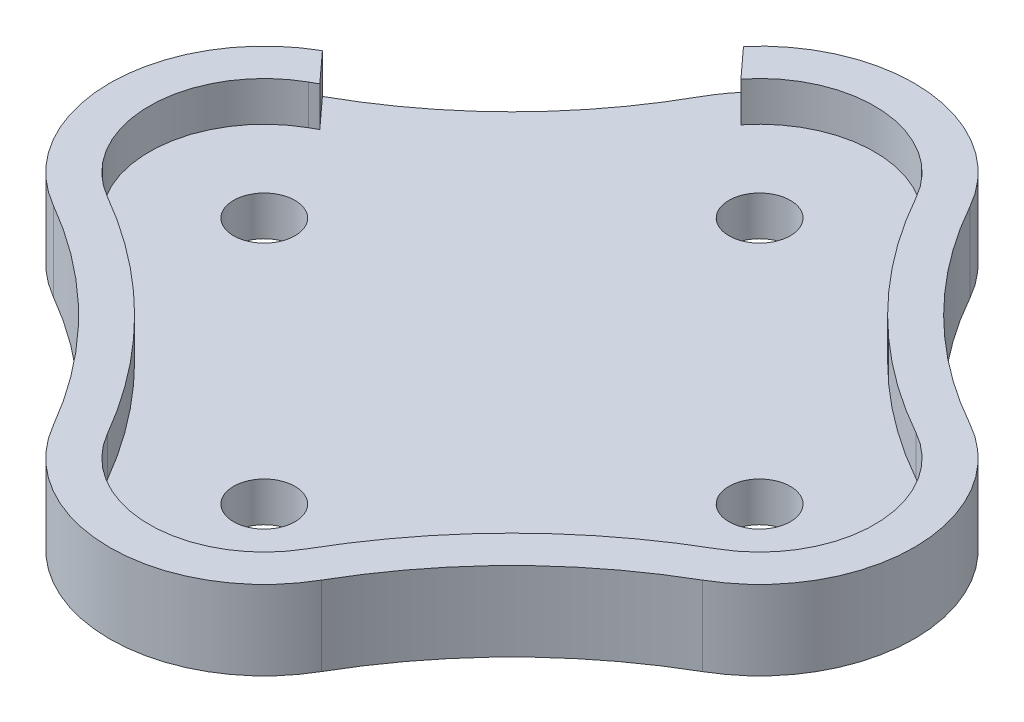
ISO-10303-21;
HEADER;
FILE_DESCRIPTION(('STEP AP214'),'2;1');
FILE_NAME('part.step','',(''),(''),'','','');
FILE_SCHEMA(('AUTOMOTIVE_DESIGN { 1 0 10303 214 1 1 1 1 }'));
ENDSEC;
DATA;
#1=APPLICATION_CONTEXT('core data for automotive mechanical design processes');
#2=APPLICATION_PROTOCOL_DEFINITION('international standard','automotive_design',2000,#1);
#3=PRODUCT_CONTEXT('',#1,'mechanical');
#4=PRODUCT('Part','Part','',(#3));
#5=PRODUCT_RELATED_PRODUCT_CATEGORY('part','',(#4));
#6=PRODUCT_DEFINITION_FORMATION('','',#4);
#7=PRODUCT_DEFINITION_CONTEXT('part definition',#1,'design');
#8=PRODUCT_DEFINITION('design','',#6,#7);
#9=PRODUCT_DEFINITION_SHAPE('','',#8);
#10=(LENGTH_UNIT() NAMED_UNIT(*) SI_UNIT(.MILLI.,.METRE.));
#11=(NAMED_UNIT(*) PLANE_ANGLE_UNIT() SI_UNIT($,.RADIAN.));
#12=(NAMED_UNIT(*) SI_UNIT($,.STERADIAN.) SOLID_ANGLE_UNIT());
#13=UNCERTAINTY_MEASURE_WITH_UNIT(LENGTH_MEASURE(1.E-05),#10,'distance_accuracy_value','');
#14=(GEOMETRIC_REPRESENTATION_CONTEXT(3) GLOBAL_UNCERTAINTY_ASSIGNED_CONTEXT((#13)) GLOBAL_UNIT_ASSIGNED_CONTEXT((#10,
#11,#12)) REPRESENTATION_CONTEXT('',''));
#15=CARTESIAN_POINT('',(0.,0.,0.));
#16=DIRECTION('',(0.,0.,1.));
#17=DIRECTION('',(1.,0.,0.));
#18=AXIS2_PLACEMENT_3D('',#15,#16,#17);
#19=CARTESIAN_POINT('',(-28.2177604684682,4.,-28.2177604684683));
#20=DIRECTION('',(0.,-1.,0.));
#21=DIRECTION('',(0.,0.,-1.));
#22=AXIS2_PLACEMENT_3D('',#19,#20,#21);
#23=CYLINDRICAL_SURFACE('',#22,24.5);
#24=CARTESIAN_POINT('',(-28.2177604684682,2.,-28.2177604684683));
#25=DIRECTION('',(0.,1.,0.));
#26=DIRECTION('',(0.,0.,1.));
#27=AXIS2_PLACEMENT_3D('',#24,#25,#26);
#28=CIRCLE('',#27,24.5);
#29=CARTESIAN_POINT('',(-6.81419602644114,2.,-16.2956201750481));
#30=VERTEX_POINT('',#29);
#31=CARTESIAN_POINT('',(-16.295620175048,2.,-6.81419602644126));
#32=VERTEX_POINT('',#31);
#33=EDGE_CURVE('E396',#30,#32,#28,.F.);
#34=ORIENTED_EDGE('',*,*,#33,.F.);
#35=DIRECTION('',(0.,-1.,0.));
#36=VECTOR('',#35,1.);
#37=CARTESIAN_POINT('',(-6.81419602644114,4.,-16.2956201750481));
#38=LINE('',#37,#36);
#39=CARTESIAN_POINT('',(-6.81419602644114,0.,-16.2956201750481));
#40=VERTEX_POINT('',#39);
#41=EDGE_CURVE('E51',#30,#40,#38,.T.);
#42=ORIENTED_EDGE('',*,*,#41,.T.);
#43=CARTESIAN_POINT('',(-28.2177604684682,0.,-28.2177604684683));
#44=DIRECTION('',(0.,1.,0.));
#45=DIRECTION('',(0.,0.,1.));
#46=AXIS2_PLACEMENT_3D('',#43,#44,#45);
#47=CIRCLE('',#46,24.5);
#48=CARTESIAN_POINT('',(-16.295620175048,0.,-6.81419602644126));
#49=VERTEX_POINT('',#48);
#50=EDGE_CURVE('E313',#40,#49,#47,.F.);
#51=ORIENTED_EDGE('',*,*,#50,.T.);
#52=DIRECTION('',(0.,-1.,0.));
#53=VECTOR('',#52,1.);
#54=CARTESIAN_POINT('',(-16.295620175048,4.,-6.81419602644126));
#55=LINE('',#54,#53);
#56=EDGE_CURVE('E352',#32,#49,#55,.T.);
#57=ORIENTED_EDGE('',*,*,#56,.F.);
#58=EDGE_LOOP('',(#34,#42,#51,#57));
#59=FACE_BOUND('',#58,.T.);
#60=ADVANCED_FACE('F41',(#59),#23,.F.);
#61=CARTESIAN_POINT('',(28.2177604684684,4.,-28.2177604684683));
#62=DIRECTION('',(0.,-1.,0.));
#63=DIRECTION('',(0.,0.,-1.));
#64=AXIS2_PLACEMENT_3D('',#61,#62,#63);
#65=CYLINDRICAL_SURFACE('',#64,24.5);
#66=CARTESIAN_POINT('',(28.2177604684684,0.,-28.2177604684683));
#67=DIRECTION('',(0.,1.,0.));
#68=DIRECTION('',(0.,0.,1.));
#69=AXIS2_PLACEMENT_3D('',#66,#67,#68);
#70=CIRCLE('',#69,24.5);
#71=CARTESIAN_POINT('',(6.81419602644138,0.,-16.2956201750481));
#72=VERTEX_POINT('',#71);
#73=CARTESIAN_POINT('',(16.2956201750482,0.,-6.81419602644127));
#74=VERTEX_POINT('',#73);
#75=EDGE_CURVE('E231',#72,#74,#70,.T.);
#76=ORIENTED_EDGE('',*,*,#75,.F.);
#77=DIRECTION('',(0.,-1.,0.));
#78=VECTOR('',#77,1.);
#79=CARTESIAN_POINT('',(6.81419602644138,4.,-16.2956201750481));
#80=LINE('',#79,#78);
#81=CARTESIAN_POINT('',(6.81419602644138,4.,-16.2956201750481));
#82=VERTEX_POINT('',#81);
#83=EDGE_CURVE('E11',#82,#72,#80,.T.);
#84=ORIENTED_EDGE('',*,*,#83,.F.);
#85=CARTESIAN_POINT('',(28.2177604684684,4.,-28.2177604684683));
#86=DIRECTION('',(0.,1.,0.));
#87=DIRECTION('',(0.,0.,1.));
#88=AXIS2_PLACEMENT_3D('',#85,#86,#87);
#89=CIRCLE('',#88,24.5);
#90=CARTESIAN_POINT('',(16.2956201750482,4.,-6.81419602644127));
#91=VERTEX_POINT('',#90);
#92=EDGE_CURVE('E279',#82,#91,#89,.T.);
#93=ORIENTED_EDGE('',*,*,#92,.T.);
#94=DIRECTION('',(0.,-1.,0.));
#95=VECTOR('',#94,1.);
#96=CARTESIAN_POINT('',(16.2956201750482,4.,-6.81419602644127));
#97=LINE('',#96,#95);
#98=EDGE_CURVE('E336',#91,#74,#97,.T.);
#99=ORIENTED_EDGE('',*,*,#98,.T.);
#100=EDGE_LOOP('',(#76,#84,#93,#99));
#101=FACE_BOUND('',#100,.T.);
#102=ADVANCED_FACE('F472',(#101),#65,.F.);
#103=CARTESIAN_POINT('',(1.2270583501045E-13,4.,-12.5));
#104=DIRECTION('',(0.,-1.,0.));
#105=DIRECTION('',(0.,0.,-1.));
#106=AXIS2_PLACEMENT_3D('',#103,#104,#105);
#107=CYLINDRICAL_SURFACE('',#106,7.79999999999999);
#108=CARTESIAN_POINT('',(1.2270583501045E-13,2.,-12.5));
#109=DIRECTION('',(0.,1.,0.));
#110=DIRECTION('',(0.,0.,1.));
#111=AXIS2_PLACEMENT_3D('',#108,#109,#110);
#112=CIRCLE('',#111,7.79999999999999);
#113=CARTESIAN_POINT('',(-5.90750188174963,2.,-17.5932721817239));
#114=VERTEX_POINT('',#113);
#115=EDGE_CURVE('E237',#114,#30,#112,.T.);
#116=ORIENTED_EDGE('',*,*,#115,.F.);
#117=DIRECTION('',(0.,-1.,0.));
#118=VECTOR('',#117,1.);
#119=CARTESIAN_POINT('',(-5.90750188174963,4.,-17.5932721817239));
#120=LINE('',#119,#118);
#121=CARTESIAN_POINT('',(-5.90750188174963,4.,-17.5932721817239));
#122=VERTEX_POINT('',#121);
#123=EDGE_CURVE('E401',#114,#122,#120,.F.);
#124=ORIENTED_EDGE('',*,*,#123,.T.);
#125=CARTESIAN_POINT('',(1.2270583501045E-13,4.,-12.5));
#126=DIRECTION('',(0.,1.,0.));
#127=DIRECTION('',(0.,0.,1.));
#128=AXIS2_PLACEMENT_3D('',#125,#126,#127);
#129=CIRCLE('',#128,7.79999999999999);
#130=EDGE_CURVE('E283',#82,#122,#129,.T.);
#131=ORIENTED_EDGE('',*,*,#130,.F.);
#132=ORIENTED_EDGE('',*,*,#83,.T.);
#133=CARTESIAN_POINT('',(1.2270583501045E-13,0.,-12.5));
#134=DIRECTION('',(0.,1.,0.));
#135=DIRECTION('',(0.,0.,1.));
#136=AXIS2_PLACEMENT_3D('',#133,#134,#135);
#137=CIRCLE('',#136,7.79999999999999);
#138=EDGE_CURVE('E309',#72,#40,#137,.T.);
#139=ORIENTED_EDGE('',*,*,#138,.T.);
#140=ORIENTED_EDGE('',*,*,#41,.F.);
#141=EDGE_LOOP('',(#116,#124,#131,#132,#139,#140));
#142=FACE_BOUND('',#141,.T.);
#143=ADVANCED_FACE('F434',(#142),#107,.T.);
#144=CARTESIAN_POINT('',(-12.4999999999999,4.,0.));
#145=DIRECTION('',(0.,-1.,0.));
#146=DIRECTION('',(0.,0.,-1.));
#147=AXIS2_PLACEMENT_3D('',#144,#145,#146);
#148=CYLINDRICAL_SURFACE('',#147,7.79999999999999);
#149=CARTESIAN_POINT('',(-12.4999999999999,4.,0.));
#150=DIRECTION('',(0.,1.,0.));
#151=DIRECTION('',(0.,0.,1.));
#152=AXIS2_PLACEMENT_3D('',#149,#150,#151);
#153=CIRCLE('',#152,7.79999999999999);
#154=CARTESIAN_POINT('',(-16.3497763919851,4.,-6.7837468799855));
#155=VERTEX_POINT('',#154);
#156=CARTESIAN_POINT('',(-16.3866068250551,4.,6.76271301974543));
#157=VERTEX_POINT('',#156);
#158=EDGE_CURVE('E287',#155,#157,#153,.T.);
#159=ORIENTED_EDGE('',*,*,#158,.F.);
#160=DIRECTION('',(0.,-1.,0.));
#161=VECTOR('',#160,1.);
#162=CARTESIAN_POINT('',(-16.3497763919851,4.,-6.7837468799855));
#163=LINE('',#162,#161);
#164=CARTESIAN_POINT('',(-16.3497763919851,2.,-6.7837468799855));
#165=VERTEX_POINT('',#164);
#166=EDGE_CURVE('E59',#155,#165,#163,.T.);
#167=ORIENTED_EDGE('',*,*,#166,.T.);
#168=CARTESIAN_POINT('',(-12.4999999999999,2.,0.));
#169=DIRECTION('',(0.,1.,0.));
#170=DIRECTION('',(0.,0.,1.));
#171=AXIS2_PLACEMENT_3D('',#168,#169,#170);
#172=CIRCLE('',#171,7.79999999999999);
#173=EDGE_CURVE('E188',#32,#165,#172,.T.);
#174=ORIENTED_EDGE('',*,*,#173,.F.);
#175=ORIENTED_EDGE('',*,*,#56,.T.);
#176=CARTESIAN_POINT('',(-12.4999999999999,0.,0.));
#177=DIRECTION('',(0.,1.,0.));
#178=DIRECTION('',(0.,0.,1.));
#179=AXIS2_PLACEMENT_3D('',#176,#177,#178);
#180=CIRCLE('',#179,7.79999999999999);
#181=CARTESIAN_POINT('',(-16.3866068250551,0.,6.76271301974543));
#182=VERTEX_POINT('',#181);
#183=EDGE_CURVE('E317',#49,#182,#180,.T.);
#184=ORIENTED_EDGE('',*,*,#183,.T.);
#185=DIRECTION('',(0.,-1.,0.));
#186=VECTOR('',#185,1.);
#187=CARTESIAN_POINT('',(-16.3866068250551,4.,6.76271301974543));
#188=LINE('',#187,#186);
#189=EDGE_CURVE('E348',#157,#182,#188,.T.);
#190=ORIENTED_EDGE('',*,*,#189,.F.);
#191=EDGE_LOOP('',(#159,#167,#174,#175,#184,#190));
#192=FACE_BOUND('',#191,.T.);
#193=ADVANCED_FACE('F443',(#192),#148,.T.);
#194=CARTESIAN_POINT('',(-29.3917912012012,4.,29.3917912012013));
#195=DIRECTION('',(0.,-1.,0.));
#196=DIRECTION('',(0.,0.,-1.));
#197=AXIS2_PLACEMENT_3D('',#194,#195,#196);
#198=CYLINDRICAL_SURFACE('',#197,26.1);
#199=CARTESIAN_POINT('',(-29.3917912012012,0.,29.3917912012013));
#200=DIRECTION('',(0.,1.,0.));
#201=DIRECTION('',(0.,0.,1.));
#202=AXIS2_PLACEMENT_3D('',#199,#200,#201);
#203=CIRCLE('',#202,26.1);
#204=CARTESIAN_POINT('',(-6.76271301974532,0.,16.3866068250552));
#205=VERTEX_POINT('',#204);
#206=EDGE_CURVE('E321',#182,#205,#203,.F.);
#207=ORIENTED_EDGE('',*,*,#206,.T.);
#208=DIRECTION('',(0.,-1.,0.));
#209=VECTOR('',#208,1.);
#210=CARTESIAN_POINT('',(-6.76271301974532,4.,16.3866068250552));
#211=LINE('',#210,#209);
#212=CARTESIAN_POINT('',(-6.76271301974532,4.,16.3866068250552));
#213=VERTEX_POINT('',#212);
#214=EDGE_CURVE('E345',#213,#205,#211,.T.);
#215=ORIENTED_EDGE('',*,*,#214,.F.);
#216=CARTESIAN_POINT('',(-29.3917912012012,4.,29.3917912012013));
#217=DIRECTION('',(0.,1.,0.));
#218=DIRECTION('',(0.,0.,1.));
#219=AXIS2_PLACEMENT_3D('',#216,#217,#218);
#220=CIRCLE('',#219,26.1);
#221=EDGE_CURVE('E290',#157,#213,#220,.F.);
#222=ORIENTED_EDGE('',*,*,#221,.F.);
#223=ORIENTED_EDGE('',*,*,#189,.T.);
#224=EDGE_LOOP('',(#207,#215,#222,#223));
#225=FACE_BOUND('',#224,.T.);
#226=ADVANCED_FACE('F453',(#225),#198,.F.);
#227=CARTESIAN_POINT('',(1.25767452008319E-13,4.,12.5));
#228=DIRECTION('',(0.,-1.,0.));
#229=DIRECTION('',(0.,0.,-1.));
#230=AXIS2_PLACEMENT_3D('',#227,#228,#229);
#231=CYLINDRICAL_SURFACE('',#230,7.8);
#232=CARTESIAN_POINT('',(1.25767452008319E-13,0.,12.5));
#233=DIRECTION('',(0.,1.,0.));
#234=DIRECTION('',(0.,0.,1.));
#235=AXIS2_PLACEMENT_3D('',#232,#233,#234);
#236=CIRCLE('',#235,7.8);
#237=CARTESIAN_POINT('',(6.76271301974557,0.,16.3866068250552));
#238=VERTEX_POINT('',#237);
#239=EDGE_CURVE('E325',#238,#205,#236,.F.);
#240=ORIENTED_EDGE('',*,*,#239,.F.);
#241=DIRECTION('',(0.,-1.,0.));
#242=VECTOR('',#241,1.);
#243=CARTESIAN_POINT('',(6.76271301974557,4.,16.3866068250552));
#244=LINE('',#243,#242);
#245=CARTESIAN_POINT('',(6.76271301974557,4.,16.3866068250552));
#246=VERTEX_POINT('',#245);
#247=EDGE_CURVE('E342',#246,#238,#244,.T.);
#248=ORIENTED_EDGE('',*,*,#247,.F.);
#249=CARTESIAN_POINT('',(1.25767452008319E-13,4.,12.5));
#250=DIRECTION('',(0.,1.,0.));
#251=DIRECTION('',(0.,0.,1.));
#252=AXIS2_PLACEMENT_3D('',#249,#250,#251);
#253=CIRCLE('',#252,7.8);
#254=EDGE_CURVE('E293',#246,#213,#253,.F.);
#255=ORIENTED_EDGE('',*,*,#254,.T.);
#256=ORIENTED_EDGE('',*,*,#214,.T.);
#257=EDGE_LOOP('',(#240,#248,#255,#256));
#258=FACE_BOUND('',#257,.T.);
#259=ADVANCED_FACE('F613',(#258),#231,.T.);
#260=CARTESIAN_POINT('',(29.3917912012015,4.,29.3917912012013));
#261=DIRECTION('',(0.,-1.,0.));
#262=DIRECTION('',(0.,0.,-1.));
#263=AXIS2_PLACEMENT_3D('',#260,#261,#262);
#264=CYLINDRICAL_SURFACE('',#263,26.1);
#265=CARTESIAN_POINT('',(29.3917912012015,0.,29.3917912012013));
#266=DIRECTION('',(0.,1.,0.));
#267=DIRECTION('',(0.,0.,1.));
#268=AXIS2_PLACEMENT_3D('',#265,#266,#267);
#269=CIRCLE('',#268,26.1);
#270=CARTESIAN_POINT('',(16.3866068250553,0.,6.76271301974544));
#271=VERTEX_POINT('',#270);
#272=EDGE_CURVE('E329',#271,#238,#269,.T.);
#273=ORIENTED_EDGE('',*,*,#272,.F.);
#274=DIRECTION('',(0.,-1.,0.));
#275=VECTOR('',#274,1.);
#276=CARTESIAN_POINT('',(16.3866068250553,4.,6.76271301974544));
#277=LINE('',#276,#275);
#278=CARTESIAN_POINT('',(16.3866068250553,4.,6.76271301974544));
#279=VERTEX_POINT('',#278);
#280=EDGE_CURVE('E339',#279,#271,#277,.T.);
#281=ORIENTED_EDGE('',*,*,#280,.F.);
#282=CARTESIAN_POINT('',(29.3917912012015,4.,29.3917912012013));
#283=DIRECTION('',(0.,1.,0.));
#284=DIRECTION('',(0.,0.,1.));
#285=AXIS2_PLACEMENT_3D('',#282,#283,#284);
#286=CIRCLE('',#285,26.1);
#287=EDGE_CURVE('E297',#279,#246,#286,.T.);
#288=ORIENTED_EDGE('',*,*,#287,.T.);
#289=ORIENTED_EDGE('',*,*,#247,.T.);
#290=EDGE_LOOP('',(#273,#281,#288,#289));
#291=FACE_BOUND('',#290,.T.);
#292=ADVANCED_FACE('F619',(#291),#264,.F.);
#293=CARTESIAN_POINT('',(12.5000000000001,4.,0.));
#294=DIRECTION('',(0.,-1.,0.));
#295=DIRECTION('',(0.,0.,-1.));
#296=AXIS2_PLACEMENT_3D('',#293,#294,#295);
#297=CYLINDRICAL_SURFACE('',#296,5.79999999999999);
#298=DIRECTION('',(0.,-1.,0.));
#299=VECTOR('',#298,1.);
#300=CARTESIAN_POINT('',(15.3223842327282,4.,-5.06696627607171));
#301=LINE('',#300,#299);
#302=CARTESIAN_POINT('',(15.3223842327282,4.,-5.06696627607171));
#303=VERTEX_POINT('',#302);
#304=CARTESIAN_POINT('',(15.3223842327282,2.,-5.06696627607171));
#305=VERTEX_POINT('',#304);
#306=EDGE_CURVE('E305',#303,#305,#301,.T.);
#307=ORIENTED_EDGE('',*,*,#306,.T.);
#308=CARTESIAN_POINT('',(12.5000000000001,2.,0.));
#309=DIRECTION('',(0.,1.,0.));
#310=DIRECTION('',(0.,0.,1.));
#311=AXIS2_PLACEMENT_3D('',#308,#309,#310);
#312=CIRCLE('',#311,5.79999999999999);
#313=CARTESIAN_POINT('',(15.3900409724771,2.,5.02868404032352));
#314=VERTEX_POINT('',#313);
#315=EDGE_CURVE('E67',#305,#314,#312,.F.);
#316=ORIENTED_EDGE('',*,*,#315,.T.);
#317=DIRECTION('',(0.,-1.,0.));
#318=VECTOR('',#317,1.);
#319=CARTESIAN_POINT('',(15.3900409724771,4.,5.02868404032352));
#320=LINE('',#319,#318);
#321=CARTESIAN_POINT('',(15.3900409724771,4.,5.02868404032352));
#322=VERTEX_POINT('',#321);
#323=EDGE_CURVE('E45',#322,#314,#320,.T.);
#324=ORIENTED_EDGE('',*,*,#323,.F.);
#325=CARTESIAN_POINT('',(12.5000000000001,4.,0.));
#326=DIRECTION('',(0.,1.,0.));
#327=DIRECTION('',(0.,0.,1.));
#328=AXIS2_PLACEMENT_3D('',#325,#326,#327);
#329=CIRCLE('',#328,5.79999999999999);
#330=EDGE_CURVE('E250',#303,#322,#329,.F.);
#331=ORIENTED_EDGE('',*,*,#330,.F.);
#332=EDGE_LOOP('',(#307,#316,#324,#331));
#333=FACE_BOUND('',#332,.T.);
#334=ADVANCED_FACE('F43',(#333),#297,.F.);
#335=CARTESIAN_POINT('',(29.3917912012015,4.,29.3917912012013));
#336=DIRECTION('',(0.,-1.,0.));
#337=DIRECTION('',(0.,0.,-1.));
#338=AXIS2_PLACEMENT_3D('',#335,#336,#337);
#339=CYLINDRICAL_SURFACE('',#338,28.1);
#340=ORIENTED_EDGE('',*,*,#323,.T.);
#341=CARTESIAN_POINT('',(29.3917912012015,2.,29.3917912012013));
#342=DIRECTION('',(0.,1.,0.));
#343=DIRECTION('',(0.,0.,1.));
#344=AXIS2_PLACEMENT_3D('',#341,#342,#343);
#345=CIRCLE('',#344,28.1);
#346=CARTESIAN_POINT('',(5.02868404032366,2.,15.3900409724769));
#347=VERTEX_POINT('',#346);
#348=EDGE_CURVE('E249',#314,#347,#345,.T.);
#349=ORIENTED_EDGE('',*,*,#348,.T.);
#350=DIRECTION('',(0.,-1.,0.));
#351=VECTOR('',#350,1.);
#352=CARTESIAN_POINT('',(5.02868404032366,4.,15.3900409724769));
#353=LINE('',#352,#351);
#354=CARTESIAN_POINT('',(5.02868404032366,4.,15.3900409724769));
#355=VERTEX_POINT('',#354);
#356=EDGE_CURVE('E373',#355,#347,#353,.T.);
#357=ORIENTED_EDGE('',*,*,#356,.F.);
#358=CARTESIAN_POINT('',(29.3917912012015,4.,29.3917912012013));
#359=DIRECTION('',(0.,1.,0.));
#360=DIRECTION('',(0.,0.,1.));
#361=AXIS2_PLACEMENT_3D('',#358,#359,#360);
#362=CIRCLE('',#361,28.1);
#363=EDGE_CURVE('E254',#322,#355,#362,.T.);
#364=ORIENTED_EDGE('',*,*,#363,.F.);
#365=EDGE_LOOP('',(#340,#349,#357,#364));
#366=FACE_BOUND('',#365,.T.);
#367=ADVANCED_FACE('F384',(#366),#339,.T.);
#368=CARTESIAN_POINT('',(1.25767452008319E-13,4.,12.5));
#369=DIRECTION('',(0.,-1.,0.));
#370=DIRECTION('',(0.,0.,-1.));
#371=AXIS2_PLACEMENT_3D('',#368,#369,#370);
#372=CYLINDRICAL_SURFACE('',#371,5.79999999999999);
#373=ORIENTED_EDGE('',*,*,#356,.T.);
#374=CARTESIAN_POINT('',(1.25767452008319E-13,2.,12.5));
#375=DIRECTION('',(0.,1.,0.));
#376=DIRECTION('',(0.,0.,1.));
#377=AXIS2_PLACEMENT_3D('',#374,#375,#376);
#378=CIRCLE('',#377,5.79999999999999);
#379=CARTESIAN_POINT('',(-5.0286840403234,2.,15.3900409724769));
#380=VERTEX_POINT('',#379);
#381=EDGE_CURVE('E211',#347,#380,#378,.F.);
#382=ORIENTED_EDGE('',*,*,#381,.T.);
#383=DIRECTION('',(0.,-1.,0.));
#384=VECTOR('',#383,1.);
#385=CARTESIAN_POINT('',(-5.0286840403234,4.,15.3900409724769));
#386=LINE('',#385,#384);
#387=CARTESIAN_POINT('',(-5.0286840403234,4.,15.3900409724769));
#388=VERTEX_POINT('',#387);
#389=EDGE_CURVE('E370',#388,#380,#386,.T.);
#390=ORIENTED_EDGE('',*,*,#389,.F.);
#391=CARTESIAN_POINT('',(1.25767452008319E-13,4.,12.5));
#392=DIRECTION('',(0.,1.,0.));
#393=DIRECTION('',(0.,0.,1.));
#394=AXIS2_PLACEMENT_3D('',#391,#392,#393);
#395=CIRCLE('',#394,5.79999999999999);
#396=EDGE_CURVE('E258',#355,#388,#395,.F.);
#397=ORIENTED_EDGE('',*,*,#396,.F.);
#398=EDGE_LOOP('',(#373,#382,#390,#397));
#399=FACE_BOUND('',#398,.T.);
#400=ADVANCED_FACE('F463',(#399),#372,.F.);
#401=CARTESIAN_POINT('',(-29.3917912012012,4.,29.3917912012013));
#402=DIRECTION('',(0.,-1.,0.));
#403=DIRECTION('',(0.,0.,-1.));
#404=AXIS2_PLACEMENT_3D('',#401,#402,#403);
#405=CYLINDRICAL_SURFACE('',#404,28.1);
#406=CARTESIAN_POINT('',(-29.3917912012012,2.,29.3917912012013));
#407=DIRECTION('',(0.,1.,0.));
#408=DIRECTION('',(0.,0.,1.));
#409=AXIS2_PLACEMENT_3D('',#406,#407,#408);
#410=CIRCLE('',#409,28.1);
#411=CARTESIAN_POINT('',(-15.3900409724768,2.,5.02868404032353));
#412=VERTEX_POINT('',#411);
#413=EDGE_CURVE('E202',#412,#380,#410,.F.);
#414=ORIENTED_EDGE('',*,*,#413,.F.);
#415=DIRECTION('',(0.,-1.,0.));
#416=VECTOR('',#415,1.);
#417=CARTESIAN_POINT('',(-15.3900409724768,4.,5.02868404032353));
#418=LINE('',#417,#416);
#419=CARTESIAN_POINT('',(-15.3900409724768,4.,5.02868404032353));
#420=VERTEX_POINT('',#419);
#421=EDGE_CURVE('E366',#420,#412,#418,.T.);
#422=ORIENTED_EDGE('',*,*,#421,.F.);
#423=CARTESIAN_POINT('',(-29.3917912012012,4.,29.3917912012013));
#424=DIRECTION('',(0.,1.,0.));
#425=DIRECTION('',(0.,0.,1.));
#426=AXIS2_PLACEMENT_3D('',#423,#424,#425);
#427=CIRCLE('',#426,28.1);
#428=EDGE_CURVE('E261',#420,#388,#427,.F.);
#429=ORIENTED_EDGE('',*,*,#428,.T.);
#430=ORIENTED_EDGE('',*,*,#389,.T.);
#431=EDGE_LOOP('',(#414,#422,#429,#430));
#432=FACE_BOUND('',#431,.T.);
#433=ADVANCED_FACE('F461',(#432),#405,.T.);
#434=CARTESIAN_POINT('',(-12.4999999999999,4.,0.));
#435=DIRECTION('',(0.,-1.,0.));
#436=DIRECTION('',(0.,0.,-1.));
#437=AXIS2_PLACEMENT_3D('',#434,#435,#436);
#438=CYLINDRICAL_SURFACE('',#437,5.79999999999999);
#439=CARTESIAN_POINT('',(-12.4999999999999,2.,0.));
#440=DIRECTION('',(0.,1.,0.));
#441=DIRECTION('',(0.,0.,1.));
#442=AXIS2_PLACEMENT_3D('',#439,#440,#441);
#443=CIRCLE('',#442,5.79999999999999);
#444=CARTESIAN_POINT('',(-15.3223842327279,2.,-5.06696627607171));
#445=VERTEX_POINT('',#444);
#446=EDGE_CURVE('E197',#445,#412,#443,.T.);
#447=ORIENTED_EDGE('',*,*,#446,.F.);
#448=DIRECTION('',(0.,-1.,0.));
#449=VECTOR('',#448,1.);
#450=CARTESIAN_POINT('',(-15.3223842327279,4.,-5.06696627607171));
#451=LINE('',#450,#449);
#452=CARTESIAN_POINT('',(-15.3223842327279,4.,-5.06696627607171));
#453=VERTEX_POINT('',#452);
#454=EDGE_CURVE('E195',#453,#445,#451,.T.);
#455=ORIENTED_EDGE('',*,*,#454,.F.);
#456=CARTESIAN_POINT('',(-12.4999999999999,4.,0.));
#457=DIRECTION('',(0.,1.,0.));
#458=DIRECTION('',(0.,0.,1.));
#459=AXIS2_PLACEMENT_3D('',#456,#457,#458);
#460=CIRCLE('',#459,5.79999999999999);
#461=EDGE_CURVE('E265',#453,#420,#460,.T.);
#462=ORIENTED_EDGE('',*,*,#461,.T.);
#463=ORIENTED_EDGE('',*,*,#421,.T.);
#464=EDGE_LOOP('',(#447,#455,#462,#463));
#465=FACE_BOUND('',#464,.T.);
#466=ADVANCED_FACE('F458',(#465),#438,.F.);
#467=CARTESIAN_POINT('',(-28.2177604684682,4.,-28.2177604684683));
#468=DIRECTION('',(0.,-1.,0.));
#469=DIRECTION('',(0.,0.,-1.));
#470=AXIS2_PLACEMENT_3D('',#467,#468,#469);
#471=CYLINDRICAL_SURFACE('',#470,26.5);
#472=DIRECTION('',(0.,-1.,0.));
#473=VECTOR('',#472,1.);
#474=CARTESIAN_POINT('',(-14.9665509170412,4.,-5.26878564552317));
#475=LINE('',#474,#473);
#476=CARTESIAN_POINT('',(-14.9665509170412,4.,-5.26878564552317));
#477=VERTEX_POINT('',#476);
#478=CARTESIAN_POINT('',(-14.9665509170412,2.,-5.26878564552317));
#479=VERTEX_POINT('',#478);
#480=EDGE_CURVE('E173',#477,#479,#475,.T.);
#481=ORIENTED_EDGE('',*,*,#480,.F.);
#482=CARTESIAN_POINT('',(-28.2177604684682,4.,-28.2177604684683));
#483=DIRECTION('',(0.,1.,0.));
#484=DIRECTION('',(0.,0.,1.));
#485=AXIS2_PLACEMENT_3D('',#482,#483,#484);
#486=CIRCLE('',#485,26.5);
#487=EDGE_CURVE('E269',#477,#453,#486,.F.);
#488=ORIENTED_EDGE('',*,*,#487,.T.);
#489=ORIENTED_EDGE('',*,*,#454,.T.);
#490=CARTESIAN_POINT('',(-28.2177604684682,2.,-28.2177604684683));
#491=DIRECTION('',(0.,1.,0.));
#492=DIRECTION('',(0.,0.,1.));
#493=AXIS2_PLACEMENT_3D('',#490,#491,#492);
#494=CIRCLE('',#493,26.5);
#495=EDGE_CURVE('E185',#479,#445,#494,.F.);
#496=ORIENTED_EDGE('',*,*,#495,.F.);
#497=EDGE_LOOP('',(#481,#488,#489,#496));
#498=FACE_BOUND('',#497,.T.);
#499=ADVANCED_FACE('F193',(#498),#471,.T.);
#500=CARTESIAN_POINT('',(1.2270583501045E-13,4.,-12.5));
#501=DIRECTION('',(0.,-1.,0.));
#502=DIRECTION('',(0.,0.,-1.));
#503=AXIS2_PLACEMENT_3D('',#500,#501,#502);
#504=CYLINDRICAL_SURFACE('',#503,5.79999999999999);
#505=DIRECTION('',(0.,-1.,0.));
#506=VECTOR('',#505,1.);
#507=CARTESIAN_POINT('',(-4.54592549274391,4.,-16.1020218509082));
#508=LINE('',#507,#506);
#509=CARTESIAN_POINT('',(-4.54592549274391,2.,-16.1020218509082));
#510=VERTEX_POINT('',#509);
#511=CARTESIAN_POINT('',(-4.54592549274391,4.,-16.1020218509082));
#512=VERTEX_POINT('',#511);
#513=EDGE_CURVE('E405',#510,#512,#508,.F.);
#514=ORIENTED_EDGE('',*,*,#513,.F.);
#515=CARTESIAN_POINT('',(1.2270583501045E-13,2.,-12.5));
#516=DIRECTION('',(0.,1.,0.));
#517=DIRECTION('',(0.,0.,1.));
#518=AXIS2_PLACEMENT_3D('',#515,#516,#517);
#519=CIRCLE('',#518,5.79999999999999);
#520=CARTESIAN_POINT('',(5.06696627607183,2.,-15.3223842327281));
#521=VERTEX_POINT('',#520);
#522=EDGE_CURVE('E198',#521,#510,#519,.T.);
#523=ORIENTED_EDGE('',*,*,#522,.F.);
#524=DIRECTION('',(0.,-1.,0.));
#525=VECTOR('',#524,1.);
#526=CARTESIAN_POINT('',(5.06696627607183,4.,-15.3223842327281));
#527=LINE('',#526,#525);
#528=CARTESIAN_POINT('',(5.06696627607183,4.,-15.3223842327281));
#529=VERTEX_POINT('',#528);
#530=EDGE_CURVE('E360',#529,#521,#527,.T.);
#531=ORIENTED_EDGE('',*,*,#530,.F.);
#532=CARTESIAN_POINT('',(1.2270583501045E-13,4.,-12.5));
#533=DIRECTION('',(0.,1.,0.));
#534=DIRECTION('',(0.,0.,1.));
#535=AXIS2_PLACEMENT_3D('',#532,#533,#534);
#536=CIRCLE('',#535,5.79999999999999);
#537=EDGE_CURVE('E272',#529,#512,#536,.T.);
#538=ORIENTED_EDGE('',*,*,#537,.T.);
#539=EDGE_LOOP('',(#514,#523,#531,#538));
#540=FACE_BOUND('',#539,.T.);
#541=ADVANCED_FACE('F424',(#540),#504,.F.);
#542=CARTESIAN_POINT('',(28.2177604684684,4.,-28.2177604684683));
#543=DIRECTION('',(0.,-1.,0.));
#544=DIRECTION('',(0.,0.,-1.));
#545=AXIS2_PLACEMENT_3D('',#542,#543,#544);
#546=CYLINDRICAL_SURFACE('',#545,26.5);
#547=ORIENTED_EDGE('',*,*,#530,.T.);
#548=CARTESIAN_POINT('',(28.2177604684684,2.,-28.2177604684683));
#549=DIRECTION('',(0.,1.,0.));
#550=DIRECTION('',(0.,0.,1.));
#551=AXIS2_PLACEMENT_3D('',#548,#549,#550);
#552=CIRCLE('',#551,26.5);
#553=EDGE_CURVE('E205',#521,#305,#552,.T.);
#554=ORIENTED_EDGE('',*,*,#553,.T.);
#555=ORIENTED_EDGE('',*,*,#306,.F.);
#556=CARTESIAN_POINT('',(28.2177604684684,4.,-28.2177604684683));
#557=DIRECTION('',(0.,1.,0.));
#558=DIRECTION('',(0.,0.,1.));
#559=AXIS2_PLACEMENT_3D('',#556,#557,#558);
#560=CIRCLE('',#559,26.5);
#561=EDGE_CURVE('E276',#529,#303,#560,.T.);
#562=ORIENTED_EDGE('',*,*,#561,.F.);
#563=EDGE_LOOP('',(#547,#554,#555,#562));
#564=FACE_BOUND('',#563,.T.);
#565=ADVANCED_FACE('F427',(#564),#546,.T.);
#566=CARTESIAN_POINT('',(12.5000000000001,4.,0.));
#567=DIRECTION('',(0.,-1.,0.));
#568=DIRECTION('',(0.,0.,-1.));
#569=AXIS2_PLACEMENT_3D('',#566,#567,#568);
#570=CYLINDRICAL_SURFACE('',#569,7.8);
#571=CARTESIAN_POINT('',(12.5000000000001,0.,0.));
#572=DIRECTION('',(0.,1.,0.));
#573=DIRECTION('',(0.,0.,1.));
#574=AXIS2_PLACEMENT_3D('',#571,#572,#573);
#575=CIRCLE('',#574,7.8);
#576=EDGE_CURVE('E255',#74,#271,#575,.F.);
#577=ORIENTED_EDGE('',*,*,#576,.F.);
#578=ORIENTED_EDGE('',*,*,#98,.F.);
#579=CARTESIAN_POINT('',(12.5000000000001,4.,0.));
#580=DIRECTION('',(0.,1.,0.));
#581=DIRECTION('',(0.,0.,1.));
#582=AXIS2_PLACEMENT_3D('',#579,#580,#581);
#583=CIRCLE('',#582,7.8);
#584=EDGE_CURVE('E301',#91,#279,#583,.F.);
#585=ORIENTED_EDGE('',*,*,#584,.T.);
#586=ORIENTED_EDGE('',*,*,#280,.T.);
#587=EDGE_LOOP('',(#577,#578,#585,#586));
#588=FACE_BOUND('',#587,.T.);
#589=ADVANCED_FACE('F486',(#588),#570,.T.);
#590=CARTESIAN_POINT('',(0.,4.,0.));
#591=DIRECTION('',(0.,1.,0.));
#592=DIRECTION('',(0.,0.,1.));
#593=AXIS2_PLACEMENT_3D('',#590,#591,#592);
#594=PLANE('',#593);
#595=DIRECTION('',(-0.674269364021333,0.,-0.738485493928125));
#596=VECTOR('',#595,1.);
#597=CARTESIAN_POINT('',(-2.55259116379505,4.,-13.9188461572975));
#598=LINE('',#597,#596);
#599=EDGE_CURVE('E410',#512,#122,#598,.T.);
#600=ORIENTED_EDGE('',*,*,#599,.F.);
#601=ORIENTED_EDGE('',*,*,#537,.F.);
#602=ORIENTED_EDGE('',*,*,#561,.T.);
#603=ORIENTED_EDGE('',*,*,#330,.T.);
#604=ORIENTED_EDGE('',*,*,#363,.T.);
#605=ORIENTED_EDGE('',*,*,#396,.T.);
#606=ORIENTED_EDGE('',*,*,#428,.F.);
#607=ORIENTED_EDGE('',*,*,#461,.F.);
#608=ORIENTED_EDGE('',*,*,#487,.F.);
#609=DIRECTION('',(0.674269364021332,0.,0.738485493928126));
#610=VECTOR('',#609,1.);
#611=CARTESIAN_POINT('',(-17.6754897568449,4.,-8.23571866054626));
#612=LINE('',#611,#610);
#613=EDGE_CURVE('E177',#155,#477,#612,.T.);
#614=ORIENTED_EDGE('',*,*,#613,.F.);
#615=ORIENTED_EDGE('',*,*,#158,.T.);
#616=ORIENTED_EDGE('',*,*,#221,.T.);
#617=ORIENTED_EDGE('',*,*,#254,.F.);
#618=ORIENTED_EDGE('',*,*,#287,.F.);
#619=ORIENTED_EDGE('',*,*,#584,.F.);
#620=ORIENTED_EDGE('',*,*,#92,.F.);
#621=ORIENTED_EDGE('',*,*,#130,.T.);
#622=EDGE_LOOP('',(#600,#601,#602,#603,#604,#605,#606,#607,#608,#614,#615,#616,#617,#618,#619,
#620,#621));
#623=FACE_BOUND('',#622,.T.);
#624=ADVANCED_FACE('F430',(#623),#594,.T.);
#625=CARTESIAN_POINT('',(0.,0.,0.));
#626=DIRECTION('',(0.,1.,0.));
#627=DIRECTION('',(0.,0.,1.));
#628=AXIS2_PLACEMENT_3D('',#625,#626,#627);
#629=PLANE('',#628);
#630=ORIENTED_EDGE('',*,*,#75,.T.);
#631=ORIENTED_EDGE('',*,*,#576,.T.);
#632=ORIENTED_EDGE('',*,*,#272,.T.);
#633=ORIENTED_EDGE('',*,*,#239,.T.);
#634=ORIENTED_EDGE('',*,*,#206,.F.);
#635=ORIENTED_EDGE('',*,*,#183,.F.);
#636=ORIENTED_EDGE('',*,*,#50,.F.);
#637=ORIENTED_EDGE('',*,*,#138,.F.);
#638=EDGE_LOOP('',(#630,#631,#632,#633,#634,#635,#636,#637));
#639=FACE_BOUND('',#638,.T.);
#640=CARTESIAN_POINT('',(1.25767452008319E-13,0.,12.5));
#641=DIRECTION('',(0.,1.,0.));
#642=DIRECTION('',(0.,0.,1.));
#643=AXIS2_PLACEMENT_3D('',#640,#641,#642);
#644=CIRCLE('',#643,1.55);
#645=CARTESIAN_POINT('',(1.25767452008319E-13,0.,14.05));
#646=VERTEX_POINT('',#645);
#647=EDGE_CURVE('E232',#646,#646,#644,.T.);
#648=ORIENTED_EDGE('',*,*,#647,.T.);
#649=EDGE_LOOP('',(#648));
#650=FACE_BOUND('',#649,.T.);
#651=CARTESIAN_POINT('',(12.5000000000001,0.,0.));
#652=DIRECTION('',(0.,1.,0.));
#653=DIRECTION('',(0.,0.,1.));
#654=AXIS2_PLACEMENT_3D('',#651,#652,#653);
#655=CIRCLE('',#654,1.55);
#656=CARTESIAN_POINT('',(12.5000000000001,0.,1.55));
#657=VERTEX_POINT('',#656);
#658=EDGE_CURVE('E236',#657,#657,#655,.T.);
#659=ORIENTED_EDGE('',*,*,#658,.T.);
#660=EDGE_LOOP('',(#659));
#661=FACE_BOUND('',#660,.T.);
#662=CARTESIAN_POINT('',(1.2270583501045E-13,0.,-12.5));
#663=DIRECTION('',(0.,1.,0.));
#664=DIRECTION('',(0.,0.,1.));
#665=AXIS2_PLACEMENT_3D('',#662,#663,#664);
#666=CIRCLE('',#665,1.55);
#667=CARTESIAN_POINT('',(1.2270583501045E-13,0.,-10.95));
#668=VERTEX_POINT('',#667);
#669=EDGE_CURVE('E241',#668,#668,#666,.T.);
#670=ORIENTED_EDGE('',*,*,#669,.T.);
#671=EDGE_LOOP('',(#670));
#672=FACE_BOUND('',#671,.T.);
#673=CARTESIAN_POINT('',(-12.4999999999999,0.,0.));
#674=DIRECTION('',(0.,1.,0.));
#675=DIRECTION('',(0.,0.,1.));
#676=AXIS2_PLACEMENT_3D('',#673,#674,#675);
#677=CIRCLE('',#676,1.55);
#678=CARTESIAN_POINT('',(-12.4999999999999,0.,1.55));
#679=VERTEX_POINT('',#678);
#680=EDGE_CURVE('E245',#679,#679,#677,.T.);
#681=ORIENTED_EDGE('',*,*,#680,.T.);
#682=EDGE_LOOP('',(#681));
#683=FACE_BOUND('',#682,.T.);
#684=ADVANCED_FACE('F446',(#639,#650,#661,#672,#683),#629,.F.);
#685=CARTESIAN_POINT('',(1.2270583501045E-13,2.,-12.5));
#686=DIRECTION('',(0.,-1.,0.));
#687=DIRECTION('',(0.,0.,-1.));
#688=AXIS2_PLACEMENT_3D('',#685,#686,#687);
#689=CYLINDRICAL_SURFACE('',#688,1.55);
#690=CARTESIAN_POINT('',(1.2270583501045E-13,2.,-12.5));
#691=DIRECTION('',(0.,1.,0.));
#692=DIRECTION('',(0.,0.,1.));
#693=AXIS2_PLACEMENT_3D('',#690,#691,#692);
#694=CIRCLE('',#693,1.55);
#695=CARTESIAN_POINT('',(1.2270583501045E-13,2.,-10.95));
#696=VERTEX_POINT('',#695);
#697=EDGE_CURVE('E223',#696,#696,#694,.T.);
#698=ORIENTED_EDGE('',*,*,#697,.T.);
#699=EDGE_LOOP('',(#698));
#700=FACE_BOUND('',#699,.T.);
#701=ORIENTED_EDGE('',*,*,#669,.F.);
#702=EDGE_LOOP('',(#701));
#703=FACE_BOUND('',#702,.T.);
#704=ADVANCED_FACE('F531',(#700,#703),#689,.F.);
#705=CARTESIAN_POINT('',(12.5000000000001,2.,0.));
#706=DIRECTION('',(0.,-1.,0.));
#707=DIRECTION('',(0.,0.,-1.));
#708=AXIS2_PLACEMENT_3D('',#705,#706,#707);
#709=CYLINDRICAL_SURFACE('',#708,1.55);
#710=CARTESIAN_POINT('',(12.5000000000001,2.,0.));
#711=DIRECTION('',(0.,1.,0.));
#712=DIRECTION('',(0.,0.,1.));
#713=AXIS2_PLACEMENT_3D('',#710,#711,#712);
#714=CIRCLE('',#713,1.55);
#715=CARTESIAN_POINT('',(12.5000000000001,2.,1.55));
#716=VERTEX_POINT('',#715);
#717=EDGE_CURVE('E219',#716,#716,#714,.T.);
#718=ORIENTED_EDGE('',*,*,#717,.T.);
#719=EDGE_LOOP('',(#718));
#720=FACE_BOUND('',#719,.T.);
#721=ORIENTED_EDGE('',*,*,#658,.F.);
#722=EDGE_LOOP('',(#721));
#723=FACE_BOUND('',#722,.T.);
#724=ADVANCED_FACE('F538',(#720,#723),#709,.F.);
#725=CARTESIAN_POINT('',(1.25767452008319E-13,2.,12.5));
#726=DIRECTION('',(0.,-1.,0.));
#727=DIRECTION('',(0.,0.,-1.));
#728=AXIS2_PLACEMENT_3D('',#725,#726,#727);
#729=CYLINDRICAL_SURFACE('',#728,1.55);
#730=CARTESIAN_POINT('',(1.25767452008319E-13,2.,12.5));
#731=DIRECTION('',(0.,1.,0.));
#732=DIRECTION('',(0.,0.,1.));
#733=AXIS2_PLACEMENT_3D('',#730,#731,#732);
#734=CIRCLE('',#733,1.55);
#735=CARTESIAN_POINT('',(1.25767452008319E-13,2.,14.05));
#736=VERTEX_POINT('',#735);
#737=EDGE_CURVE('E215',#736,#736,#734,.T.);
#738=ORIENTED_EDGE('',*,*,#737,.T.);
#739=EDGE_LOOP('',(#738));
#740=FACE_BOUND('',#739,.T.);
#741=ORIENTED_EDGE('',*,*,#647,.F.);
#742=EDGE_LOOP('',(#741));
#743=FACE_BOUND('',#742,.T.);
#744=ADVANCED_FACE('F546',(#740,#743),#729,.F.);
#745=CARTESIAN_POINT('',(-12.4999999999999,2.,0.));
#746=DIRECTION('',(0.,-1.,0.));
#747=DIRECTION('',(0.,0.,-1.));
#748=AXIS2_PLACEMENT_3D('',#745,#746,#747);
#749=CYLINDRICAL_SURFACE('',#748,1.55);
#750=CARTESIAN_POINT('',(-12.4999999999999,2.,0.));
#751=DIRECTION('',(0.,1.,0.));
#752=DIRECTION('',(0.,0.,1.));
#753=AXIS2_PLACEMENT_3D('',#750,#751,#752);
#754=CIRCLE('',#753,1.55);
#755=CARTESIAN_POINT('',(-12.4999999999999,2.,1.55));
#756=VERTEX_POINT('',#755);
#757=EDGE_CURVE('E227',#756,#756,#754,.T.);
#758=ORIENTED_EDGE('',*,*,#757,.T.);
#759=EDGE_LOOP('',(#758));
#760=FACE_BOUND('',#759,.T.);
#761=ORIENTED_EDGE('',*,*,#680,.F.);
#762=EDGE_LOOP('',(#761));
#763=FACE_BOUND('',#762,.T.);
#764=ADVANCED_FACE('F554',(#760,#763),#749,.F.);
#765=CARTESIAN_POINT('',(0.,2.,0.));
#766=DIRECTION('',(0.,1.,0.));
#767=DIRECTION('',(0.,0.,1.));
#768=AXIS2_PLACEMENT_3D('',#765,#766,#767);
#769=PLANE('',#768);
#770=DIRECTION('',(-0.674269364021332,0.,-0.738485493928126));
#771=VECTOR('',#770,1.);
#772=CARTESIAN_POINT('',(-17.6754897568449,2.,-8.23571866054626));
#773=LINE('',#772,#771);
#774=EDGE_CURVE('E176',#479,#165,#773,.T.);
#775=ORIENTED_EDGE('',*,*,#774,.F.);
#776=ORIENTED_EDGE('',*,*,#495,.T.);
#777=ORIENTED_EDGE('',*,*,#446,.T.);
#778=ORIENTED_EDGE('',*,*,#413,.T.);
#779=ORIENTED_EDGE('',*,*,#381,.F.);
#780=ORIENTED_EDGE('',*,*,#348,.F.);
#781=ORIENTED_EDGE('',*,*,#315,.F.);
#782=ORIENTED_EDGE('',*,*,#553,.F.);
#783=ORIENTED_EDGE('',*,*,#522,.T.);
#784=DIRECTION('',(0.674269364021333,0.,0.738485493928125));
#785=VECTOR('',#784,1.);
#786=CARTESIAN_POINT('',(-2.55259116379505,2.,-13.9188461572975));
#787=LINE('',#786,#785);
#788=EDGE_CURVE('E190',#114,#510,#787,.T.);
#789=ORIENTED_EDGE('',*,*,#788,.F.);
#790=ORIENTED_EDGE('',*,*,#115,.T.);
#791=ORIENTED_EDGE('',*,*,#33,.T.);
#792=ORIENTED_EDGE('',*,*,#173,.T.);
#793=EDGE_LOOP('',(#775,#776,#777,#778,#779,#780,#781,#782,#783,#789,#790,#791,#792));
#794=FACE_BOUND('',#793,.T.);
#795=ORIENTED_EDGE('',*,*,#737,.F.);
#796=EDGE_LOOP('',(#795));
#797=FACE_BOUND('',#796,.T.);
#798=ORIENTED_EDGE('',*,*,#717,.F.);
#799=EDGE_LOOP('',(#798));
#800=FACE_BOUND('',#799,.T.);
#801=ORIENTED_EDGE('',*,*,#697,.F.);
#802=EDGE_LOOP('',(#801));
#803=FACE_BOUND('',#802,.T.);
#804=ORIENTED_EDGE('',*,*,#757,.F.);
#805=EDGE_LOOP('',(#804));
#806=FACE_BOUND('',#805,.T.);
#807=ADVANCED_FACE('F183',(#794,#797,#800,#803,#806),#769,.T.);
#808=CARTESIAN_POINT('',(-2.55259116379505,-18.9823195085473,-13.9188461572975));
#809=DIRECTION('',(0.738485493928125,0.,-0.674269364021333));
#810=DIRECTION('',(-0.674269364021333,0.,-0.738485493928125));
#811=AXIS2_PLACEMENT_3D('',#808,#809,#810);
#812=PLANE('',#811);
#813=ORIENTED_EDGE('',*,*,#788,.T.);
#814=ORIENTED_EDGE('',*,*,#513,.T.);
#815=ORIENTED_EDGE('',*,*,#599,.T.);
#816=ORIENTED_EDGE('',*,*,#123,.F.);
#817=EDGE_LOOP('',(#813,#814,#815,#816));
#818=FACE_BOUND('',#817,.T.);
#819=ADVANCED_FACE('F419',(#818),#812,.F.);
#820=CARTESIAN_POINT('',(-17.6754897568449,-18.9823195085473,-8.23571866054626));
#821=DIRECTION('',(-0.738485493928126,0.,0.674269364021332));
#822=DIRECTION('',(0.674269364021332,0.,0.738485493928126));
#823=AXIS2_PLACEMENT_3D('',#820,#821,#822);
#824=PLANE('',#823);
#825=ORIENTED_EDGE('',*,*,#613,.T.);
#826=ORIENTED_EDGE('',*,*,#480,.T.);
#827=ORIENTED_EDGE('',*,*,#774,.T.);
#828=ORIENTED_EDGE('',*,*,#166,.F.);
#829=EDGE_LOOP('',(#825,#826,#827,#828));
#830=FACE_BOUND('',#829,.T.);
#831=ADVANCED_FACE('F175',(#830),#824,.F.);
#832=CLOSED_SHELL('',(#60,#102,#143,#193,#226,#259,#292,#334,#367,#400,#433,#466,#499,#541,#565,
#589,#624,#684,#704,#724,#744,#764,#807,#819,#831));
#833=MANIFOLD_SOLID_BREP('B2',#832);
#834=ADVANCED_BREP_SHAPE_REPRESENTATION('',(#18,#833),#14);
#835=SHAPE_DEFINITION_REPRESENTATION(#9,#834);
ENDSEC;
END-ISO-10303-21;
